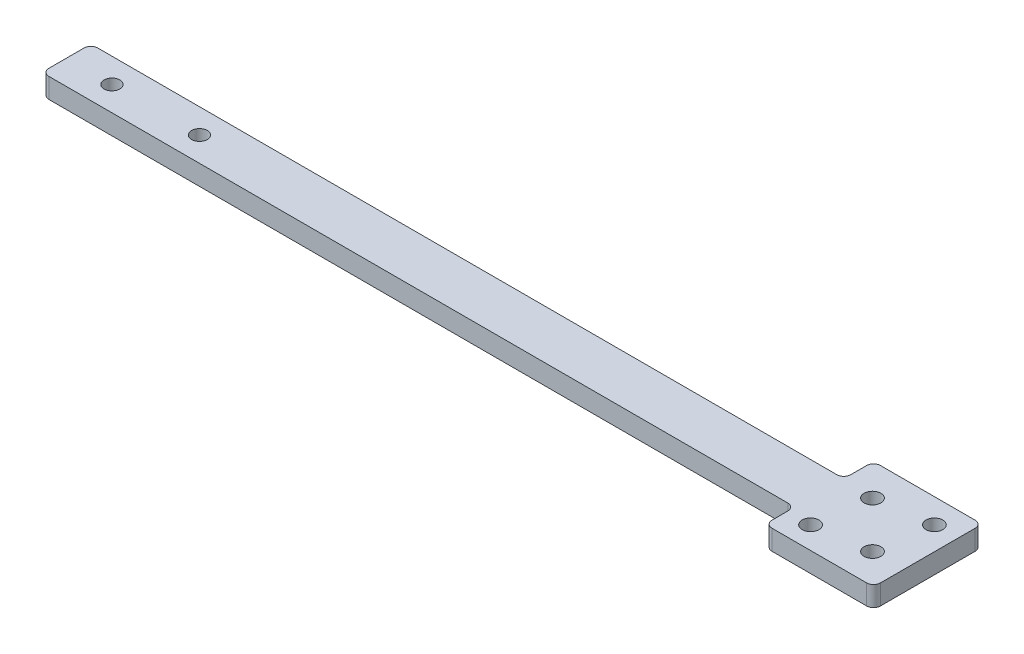
ISO-10303-21;
HEADER;
FILE_DESCRIPTION(('STEP AP214'),'2;1');
FILE_NAME('part.step','',(''),(''),'','','');
FILE_SCHEMA(('AUTOMOTIVE_DESIGN { 1 0 10303 214 1 1 1 1 }'));
ENDSEC;
DATA;
#1=APPLICATION_CONTEXT('core data for automotive mechanical design processes');
#2=APPLICATION_PROTOCOL_DEFINITION('international standard','automotive_design',2000,#1);
#3=PRODUCT_CONTEXT('',#1,'mechanical');
#4=PRODUCT('Part','Part','',(#3));
#5=PRODUCT_RELATED_PRODUCT_CATEGORY('part','',(#4));
#6=PRODUCT_DEFINITION_FORMATION('','',#4);
#7=PRODUCT_DEFINITION_CONTEXT('part definition',#1,'design');
#8=PRODUCT_DEFINITION('design','',#6,#7);
#9=PRODUCT_DEFINITION_SHAPE('','',#8);
#10=(LENGTH_UNIT() NAMED_UNIT(*) SI_UNIT(.MILLI.,.METRE.));
#11=(NAMED_UNIT(*) PLANE_ANGLE_UNIT() SI_UNIT($,.RADIAN.));
#12=(NAMED_UNIT(*) SI_UNIT($,.STERADIAN.) SOLID_ANGLE_UNIT());
#13=UNCERTAINTY_MEASURE_WITH_UNIT(LENGTH_MEASURE(1.E-05),#10,'distance_accuracy_value','');
#14=(GEOMETRIC_REPRESENTATION_CONTEXT(3) GLOBAL_UNCERTAINTY_ASSIGNED_CONTEXT((#13)) GLOBAL_UNIT_ASSIGNED_CONTEXT((#10,
#11,#12)) REPRESENTATION_CONTEXT('',''));
#15=CARTESIAN_POINT('',(0.,0.,0.));
#16=DIRECTION('',(0.,0.,1.));
#17=DIRECTION('',(1.,0.,0.));
#18=AXIS2_PLACEMENT_3D('',#15,#16,#17);
#19=CARTESIAN_POINT('',(-164.449923289991,5.715,-7.31043064824472));
#20=DIRECTION('',(1.,0.,0.));
#21=DIRECTION('',(0.,0.,-1.));
#22=AXIS2_PLACEMENT_3D('',#19,#20,#21);
#23=PLANE('',#22);
#24=DIRECTION('',(0.,0.,1.));
#25=VECTOR('',#24,1.);
#26=CARTESIAN_POINT('',(-164.449923289991,5.715,-7.31043064824472));
#27=LINE('',#26,#25);
#28=CARTESIAN_POINT('',(-164.449923289991,5.715,-5.31043064824472));
#29=VERTEX_POINT('',#28);
#30=CARTESIAN_POINT('',(-164.449923289991,5.715,4.68956935175528));
#31=VERTEX_POINT('',#30);
#32=EDGE_CURVE('E165',#29,#31,#27,.T.);
#33=ORIENTED_EDGE('',*,*,#32,.F.);
#34=DIRECTION('',(0.,-1.,0.));
#35=VECTOR('',#34,1.);
#36=CARTESIAN_POINT('',(-164.449923289991,5.715,-5.31043064824472));
#37=LINE('',#36,#35);
#38=CARTESIAN_POINT('',(-164.449923289991,0.,-5.31043064824472));
#39=VERTEX_POINT('',#38);
#40=EDGE_CURVE('E150',#29,#39,#37,.T.);
#41=ORIENTED_EDGE('',*,*,#40,.T.);
#42=DIRECTION('',(0.,0.,1.));
#43=VECTOR('',#42,1.);
#44=CARTESIAN_POINT('',(-164.449923289991,0.,-7.31043064824472));
#45=LINE('',#44,#43);
#46=CARTESIAN_POINT('',(-164.449923289991,0.,4.68956935175528));
#47=VERTEX_POINT('',#46);
#48=EDGE_CURVE('E162',#39,#47,#45,.T.);
#49=ORIENTED_EDGE('',*,*,#48,.T.);
#50=DIRECTION('',(0.,-1.,0.));
#51=VECTOR('',#50,1.);
#52=CARTESIAN_POINT('',(-164.449923289991,5.715,4.68956935175528));
#53=LINE('',#52,#51);
#54=EDGE_CURVE('E167',#47,#31,#53,.F.);
#55=ORIENTED_EDGE('',*,*,#54,.T.);
#56=EDGE_LOOP('',(#33,#41,#49,#55));
#57=FACE_BOUND('',#56,.T.);
#58=ADVANCED_FACE('F33',(#57),#23,.F.);
#59=CARTESIAN_POINT('',(-164.449923289991,5.715,6.68956935175528));
#60=DIRECTION('',(0.,0.,-1.));
#61=DIRECTION('',(-1.,0.,0.));
#62=AXIS2_PLACEMENT_3D('',#59,#60,#61);
#63=PLANE('',#62);
#64=DIRECTION('',(1.,0.,0.));
#65=VECTOR('',#64,1.);
#66=CARTESIAN_POINT('',(-164.449923289991,5.715,6.68956935175528));
#67=LINE('',#66,#65);
#68=CARTESIAN_POINT('',(-162.449923289991,5.715,6.68956935175528));
#69=VERTEX_POINT('',#68);
#70=CARTESIAN_POINT('',(48.5500767100088,5.715,6.68956935175528));
#71=VERTEX_POINT('',#70);
#72=EDGE_CURVE('E203',#69,#71,#67,.T.);
#73=ORIENTED_EDGE('',*,*,#72,.F.);
#74=DIRECTION('',(0.,-1.,0.));
#75=VECTOR('',#74,1.);
#76=CARTESIAN_POINT('',(-162.449923289991,5.715,6.68956935175528));
#77=LINE('',#76,#75);
#78=CARTESIAN_POINT('',(-162.449923289991,0.,6.68956935175528));
#79=VERTEX_POINT('',#78);
#80=EDGE_CURVE('E259',#69,#79,#77,.T.);
#81=ORIENTED_EDGE('',*,*,#80,.T.);
#82=DIRECTION('',(1.,0.,0.));
#83=VECTOR('',#82,1.);
#84=CARTESIAN_POINT('',(-164.449923289991,0.,6.68956935175528));
#85=LINE('',#84,#83);
#86=CARTESIAN_POINT('',(48.5500767100088,0.,6.68956935175528));
#87=VERTEX_POINT('',#86);
#88=EDGE_CURVE('E171',#79,#87,#85,.T.);
#89=ORIENTED_EDGE('',*,*,#88,.T.);
#90=DIRECTION('',(0.,-1.,0.));
#91=VECTOR('',#90,1.);
#92=CARTESIAN_POINT('',(48.5500767100088,5.715,6.68956935175528));
#93=LINE('',#92,#91);
#94=EDGE_CURVE('E256',#87,#71,#93,.F.);
#95=ORIENTED_EDGE('',*,*,#94,.T.);
#96=EDGE_LOOP('',(#73,#81,#89,#95));
#97=FACE_BOUND('',#96,.T.);
#98=ADVANCED_FACE('F299',(#97),#63,.F.);
#99=CARTESIAN_POINT('',(-164.449923289991,5.715,-7.31043064824472));
#100=DIRECTION('',(0.,0.,1.));
#101=DIRECTION('',(1.,0.,0.));
#102=AXIS2_PLACEMENT_3D('',#99,#100,#101);
#103=PLANE('',#102);
#104=DIRECTION('',(-1.,0.,0.));
#105=VECTOR('',#104,1.);
#106=CARTESIAN_POINT('',(-164.449923289991,0.,-7.31043064824472));
#107=LINE('',#106,#105);
#108=CARTESIAN_POINT('',(48.5500767100088,0.,-7.31043064824472));
#109=VERTEX_POINT('',#108);
#110=CARTESIAN_POINT('',(-162.449923289991,0.,-7.31043064824472));
#111=VERTEX_POINT('',#110);
#112=EDGE_CURVE('E175',#109,#111,#107,.T.);
#113=ORIENTED_EDGE('',*,*,#112,.T.);
#114=DIRECTION('',(0.,-1.,0.));
#115=VECTOR('',#114,1.);
#116=CARTESIAN_POINT('',(-162.449923289991,5.715,-7.31043064824472));
#117=LINE('',#116,#115);
#118=CARTESIAN_POINT('',(-162.449923289991,5.715,-7.31043064824472));
#119=VERTEX_POINT('',#118);
#120=EDGE_CURVE('E151',#111,#119,#117,.F.);
#121=ORIENTED_EDGE('',*,*,#120,.T.);
#122=DIRECTION('',(-1.,0.,0.));
#123=VECTOR('',#122,1.);
#124=CARTESIAN_POINT('',(-164.449923289991,5.715,-7.31043064824472));
#125=LINE('',#124,#123);
#126=CARTESIAN_POINT('',(48.5500767100088,5.715,-7.31043064824472));
#127=VERTEX_POINT('',#126);
#128=EDGE_CURVE('E200',#127,#119,#125,.T.);
#129=ORIENTED_EDGE('',*,*,#128,.F.);
#130=DIRECTION('',(0.,-1.,0.));
#131=VECTOR('',#130,1.);
#132=CARTESIAN_POINT('',(48.5500767100088,5.715,-7.31043064824472));
#133=LINE('',#132,#131);
#134=EDGE_CURVE('E156',#127,#109,#133,.T.);
#135=ORIENTED_EDGE('',*,*,#134,.T.);
#136=EDGE_LOOP('',(#113,#121,#129,#135));
#137=FACE_BOUND('',#136,.T.);
#138=ADVANCED_FACE('F246',(#137),#103,.F.);
#139=CARTESIAN_POINT('',(0.,5.715,0.));
#140=DIRECTION('',(0.,1.,0.));
#141=DIRECTION('',(0.,0.,1.));
#142=AXIS2_PLACEMENT_3D('',#139,#140,#141);
#143=PLANE('',#142);
#144=CARTESIAN_POINT('',(72.6615251141029,5.715,6.61144840409427));
#145=DIRECTION('',(0.,1.,0.));
#146=DIRECTION('',(0.,0.,1.));
#147=AXIS2_PLACEMENT_3D('',#144,#145,#146);
#148=CIRCLE('',#147,2.40000000000001);
#149=CARTESIAN_POINT('',(72.6615251141029,5.715,9.01144840409428));
#150=VERTEX_POINT('',#149);
#151=EDGE_CURVE('E353',#150,#150,#148,.T.);
#152=ORIENTED_EDGE('',*,*,#151,.F.);
#153=EDGE_LOOP('',(#152));
#154=FACE_BOUND('',#153,.T.);
#155=CARTESIAN_POINT('',(74.8889114748407,5.715,-8.83883476483178));
#156=DIRECTION('',(0.,1.,0.));
#157=DIRECTION('',(0.,0.,1.));
#158=AXIS2_PLACEMENT_3D('',#155,#156,#157);
#159=CIRCLE('',#158,2.39999999999999);
#160=CARTESIAN_POINT('',(74.8889114748407,5.715,-6.43883476483179));
#161=VERTEX_POINT('',#160);
#162=EDGE_CURVE('E349',#161,#161,#159,.T.);
#163=ORIENTED_EDGE('',*,*,#162,.F.);
#164=EDGE_LOOP('',(#163));
#165=FACE_BOUND('',#164,.T.);
#166=CARTESIAN_POINT('',(59.4386283059146,5.715,-6.61144840409425));
#167=DIRECTION('',(0.,1.,0.));
#168=DIRECTION('',(0.,0.,1.));
#169=AXIS2_PLACEMENT_3D('',#166,#167,#168);
#170=CIRCLE('',#169,2.39999999999999);
#171=CARTESIAN_POINT('',(59.4386283059146,5.715,-4.21144840409426));
#172=VERTEX_POINT('',#171);
#173=EDGE_CURVE('E345',#172,#172,#170,.T.);
#174=ORIENTED_EDGE('',*,*,#173,.F.);
#175=EDGE_LOOP('',(#174));
#176=FACE_BOUND('',#175,.T.);
#177=CARTESIAN_POINT('',(57.2112419451769,5.715,8.83883476483181));
#178=DIRECTION('',(0.,1.,0.));
#179=DIRECTION('',(0.,0.,1.));
#180=AXIS2_PLACEMENT_3D('',#177,#178,#179);
#181=CIRCLE('',#180,2.40000000000002);
#182=CARTESIAN_POINT('',(57.2112419451769,5.715,11.2388347648318));
#183=VERTEX_POINT('',#182);
#184=EDGE_CURVE('E314',#183,#183,#181,.T.);
#185=ORIENTED_EDGE('',*,*,#184,.F.);
#186=EDGE_LOOP('',(#185));
#187=FACE_BOUND('',#186,.T.);
#188=CARTESIAN_POINT('',(-126.449923289991,5.715,-0.31043064824469));
#189=DIRECTION('',(0.,1.,0.));
#190=DIRECTION('',(0.,0.,1.));
#191=AXIS2_PLACEMENT_3D('',#188,#189,#190);
#192=CIRCLE('',#191,2.25);
#193=CARTESIAN_POINT('',(-126.449923289991,5.715,1.93956935175531));
#194=VERTEX_POINT('',#193);
#195=EDGE_CURVE('E234',#194,#194,#192,.T.);
#196=ORIENTED_EDGE('',*,*,#195,.F.);
#197=EDGE_LOOP('',(#196));
#198=FACE_BOUND('',#197,.T.);
#199=CARTESIAN_POINT('',(-151.449923289991,5.715,-0.31043064824469));
#200=DIRECTION('',(0.,1.,0.));
#201=DIRECTION('',(0.,0.,1.));
#202=AXIS2_PLACEMENT_3D('',#199,#200,#201);
#203=CIRCLE('',#202,2.25000000000001);
#204=CARTESIAN_POINT('',(-151.449923289991,5.715,1.93956935175532));
#205=VERTEX_POINT('',#204);
#206=EDGE_CURVE('E178',#205,#205,#203,.T.);
#207=ORIENTED_EDGE('',*,*,#206,.F.);
#208=EDGE_LOOP('',(#207));
#209=FACE_BOUND('',#208,.T.);
#210=ORIENTED_EDGE('',*,*,#128,.T.);
#211=CARTESIAN_POINT('',(-162.449923289991,5.715,-5.31043064824472));
#212=DIRECTION('',(0.,1.,0.));
#213=DIRECTION('',(0.,0.,1.));
#214=AXIS2_PLACEMENT_3D('',#211,#212,#213);
#215=CIRCLE('',#214,2.);
#216=EDGE_CURVE('E250',#119,#29,#215,.T.);
#217=ORIENTED_EDGE('',*,*,#216,.T.);
#218=ORIENTED_EDGE('',*,*,#32,.T.);
#219=CARTESIAN_POINT('',(-162.449923289991,5.715,4.68956935175528));
#220=DIRECTION('',(0.,1.,0.));
#221=DIRECTION('',(0.,0.,1.));
#222=AXIS2_PLACEMENT_3D('',#219,#220,#221);
#223=CIRCLE('',#222,2.);
#224=EDGE_CURVE('E257',#31,#69,#223,.T.);
#225=ORIENTED_EDGE('',*,*,#224,.T.);
#226=ORIENTED_EDGE('',*,*,#72,.T.);
#227=CARTESIAN_POINT('',(48.5500767100088,5.715,8.68956935175528));
#228=DIRECTION('',(0.,1.,0.));
#229=DIRECTION('',(0.,0.,1.));
#230=AXIS2_PLACEMENT_3D('',#227,#228,#229);
#231=CIRCLE('',#230,2.);
#232=CARTESIAN_POINT('',(50.5500767100088,5.715,8.68956935175528));
#233=VERTEX_POINT('',#232);
#234=EDGE_CURVE('E11',#71,#233,#231,.F.);
#235=ORIENTED_EDGE('',*,*,#234,.T.);
#236=DIRECTION('',(0.,0.,1.));
#237=VECTOR('',#236,1.);
#238=CARTESIAN_POINT('',(50.5500767100088,5.715,-15.8104306482447));
#239=LINE('',#238,#237);
#240=CARTESIAN_POINT('',(50.5500767100088,5.715,13.1895693517553));
#241=VERTEX_POINT('',#240);
#242=EDGE_CURVE('E306',#233,#241,#239,.T.);
#243=ORIENTED_EDGE('',*,*,#242,.T.);
#244=CARTESIAN_POINT('',(52.5500767100088,5.715,13.1895693517553));
#245=DIRECTION('',(0.,1.,0.));
#246=DIRECTION('',(0.,0.,1.));
#247=AXIS2_PLACEMENT_3D('',#244,#245,#246);
#248=CIRCLE('',#247,2.);
#249=CARTESIAN_POINT('',(52.5500767100088,5.715,15.1895693517553));
#250=VERTEX_POINT('',#249);
#251=EDGE_CURVE('E317',#241,#250,#248,.T.);
#252=ORIENTED_EDGE('',*,*,#251,.T.);
#253=DIRECTION('',(-1.,0.,0.));
#254=VECTOR('',#253,1.);
#255=CARTESIAN_POINT('',(81.5500767100088,5.715,15.1895693517553));
#256=LINE('',#255,#254);
#257=CARTESIAN_POINT('',(79.5500767100088,5.715,15.1895693517553));
#258=VERTEX_POINT('',#257);
#259=EDGE_CURVE('E229',#258,#250,#256,.T.);
#260=ORIENTED_EDGE('',*,*,#259,.F.);
#261=CARTESIAN_POINT('',(79.5500767100088,5.715,13.1895693517553));
#262=DIRECTION('',(0.,1.,0.));
#263=DIRECTION('',(0.,0.,1.));
#264=AXIS2_PLACEMENT_3D('',#261,#262,#263);
#265=CIRCLE('',#264,2.);
#266=CARTESIAN_POINT('',(81.5500767100088,5.715,13.1895693517553));
#267=VERTEX_POINT('',#266);
#268=EDGE_CURVE('E319',#258,#267,#265,.T.);
#269=ORIENTED_EDGE('',*,*,#268,.T.);
#270=DIRECTION('',(0.,0.,1.));
#271=VECTOR('',#270,1.);
#272=CARTESIAN_POINT('',(81.5500767100088,5.715,-15.8104306482447));
#273=LINE('',#272,#271);
#274=CARTESIAN_POINT('',(81.5500767100088,5.715,-13.8104306482447));
#275=VERTEX_POINT('',#274);
#276=EDGE_CURVE('E325',#275,#267,#273,.T.);
#277=ORIENTED_EDGE('',*,*,#276,.F.);
#278=CARTESIAN_POINT('',(79.5500767100088,5.715,-13.8104306482447));
#279=DIRECTION('',(0.,1.,0.));
#280=DIRECTION('',(0.,0.,1.));
#281=AXIS2_PLACEMENT_3D('',#278,#279,#280);
#282=CIRCLE('',#281,2.);
#283=CARTESIAN_POINT('',(79.5500767100088,5.715,-15.8104306482447));
#284=VERTEX_POINT('',#283);
#285=EDGE_CURVE('E321',#275,#284,#282,.T.);
#286=ORIENTED_EDGE('',*,*,#285,.T.);
#287=DIRECTION('',(-1.,0.,0.));
#288=VECTOR('',#287,1.);
#289=CARTESIAN_POINT('',(81.5500767100088,5.715,-15.8104306482447));
#290=LINE('',#289,#288);
#291=CARTESIAN_POINT('',(52.5500767100088,5.715,-15.8104306482447));
#292=VERTEX_POINT('',#291);
#293=EDGE_CURVE('E232',#284,#292,#290,.T.);
#294=ORIENTED_EDGE('',*,*,#293,.T.);
#295=CARTESIAN_POINT('',(52.5500767100088,5.715,-13.8104306482447));
#296=DIRECTION('',(0.,1.,0.));
#297=DIRECTION('',(0.,0.,1.));
#298=AXIS2_PLACEMENT_3D('',#295,#296,#297);
#299=CIRCLE('',#298,2.);
#300=CARTESIAN_POINT('',(50.5500767100088,5.715,-13.8104306482447));
#301=VERTEX_POINT('',#300);
#302=EDGE_CURVE('E55',#292,#301,#299,.T.);
#303=ORIENTED_EDGE('',*,*,#302,.T.);
#304=CARTESIAN_POINT('',(50.5500767100088,5.715,-9.31043064824472));
#305=VERTEX_POINT('',#304);
#306=EDGE_CURVE('E215',#301,#305,#239,.T.);
#307=ORIENTED_EDGE('',*,*,#306,.T.);
#308=CARTESIAN_POINT('',(48.5500767100088,5.715,-9.31043064824472));
#309=DIRECTION('',(0.,1.,0.));
#310=DIRECTION('',(0.,0.,1.));
#311=AXIS2_PLACEMENT_3D('',#308,#309,#310);
#312=CIRCLE('',#311,2.);
#313=EDGE_CURVE('E252',#305,#127,#312,.F.);
#314=ORIENTED_EDGE('',*,*,#313,.T.);
#315=EDGE_LOOP('',(#210,#217,#218,#225,#226,#235,#243,#252,#260,#269,#277,#286,#294,#303,#307,#314));
#316=FACE_BOUND('',#315,.T.);
#317=ADVANCED_FACE('F244',(#154,#165,#176,#187,#198,#209,#316),#143,.T.);
#318=CARTESIAN_POINT('',(0.,0.,0.));
#319=DIRECTION('',(0.,1.,0.));
#320=DIRECTION('',(0.,0.,1.));
#321=AXIS2_PLACEMENT_3D('',#318,#319,#320);
#322=PLANE('',#321);
#323=CARTESIAN_POINT('',(72.6615251141029,0.,6.61144840409427));
#324=DIRECTION('',(0.,1.,0.));
#325=DIRECTION('',(0.,0.,1.));
#326=AXIS2_PLACEMENT_3D('',#323,#324,#325);
#327=CIRCLE('',#326,2.40000000000001);
#328=CARTESIAN_POINT('',(72.6615251141029,0.,9.01144840409428));
#329=VERTEX_POINT('',#328);
#330=EDGE_CURVE('E352',#329,#329,#327,.T.);
#331=ORIENTED_EDGE('',*,*,#330,.T.);
#332=EDGE_LOOP('',(#331));
#333=FACE_BOUND('',#332,.T.);
#334=CARTESIAN_POINT('',(74.8889114748407,0.,-8.83883476483178));
#335=DIRECTION('',(0.,1.,0.));
#336=DIRECTION('',(0.,0.,1.));
#337=AXIS2_PLACEMENT_3D('',#334,#335,#336);
#338=CIRCLE('',#337,2.39999999999999);
#339=CARTESIAN_POINT('',(74.8889114748407,0.,-6.43883476483179));
#340=VERTEX_POINT('',#339);
#341=EDGE_CURVE('E348',#340,#340,#338,.T.);
#342=ORIENTED_EDGE('',*,*,#341,.T.);
#343=EDGE_LOOP('',(#342));
#344=FACE_BOUND('',#343,.T.);
#345=CARTESIAN_POINT('',(59.4386283059146,0.,-6.61144840409425));
#346=DIRECTION('',(0.,1.,0.));
#347=DIRECTION('',(0.,0.,1.));
#348=AXIS2_PLACEMENT_3D('',#345,#346,#347);
#349=CIRCLE('',#348,2.39999999999999);
#350=CARTESIAN_POINT('',(59.4386283059146,0.,-4.21144840409426));
#351=VERTEX_POINT('',#350);
#352=EDGE_CURVE('E344',#351,#351,#349,.T.);
#353=ORIENTED_EDGE('',*,*,#352,.T.);
#354=EDGE_LOOP('',(#353));
#355=FACE_BOUND('',#354,.T.);
#356=CARTESIAN_POINT('',(57.2112419451769,0.,8.83883476483181));
#357=DIRECTION('',(0.,1.,0.));
#358=DIRECTION('',(0.,0.,1.));
#359=AXIS2_PLACEMENT_3D('',#356,#357,#358);
#360=CIRCLE('',#359,2.40000000000002);
#361=CARTESIAN_POINT('',(57.2112419451769,0.,11.2388347648318));
#362=VERTEX_POINT('',#361);
#363=EDGE_CURVE('E209',#362,#362,#360,.T.);
#364=ORIENTED_EDGE('',*,*,#363,.T.);
#365=EDGE_LOOP('',(#364));
#366=FACE_BOUND('',#365,.T.);
#367=CARTESIAN_POINT('',(-126.449923289991,0.,-0.31043064824469));
#368=DIRECTION('',(0.,1.,0.));
#369=DIRECTION('',(0.,0.,1.));
#370=AXIS2_PLACEMENT_3D('',#367,#368,#369);
#371=CIRCLE('',#370,2.25);
#372=CARTESIAN_POINT('',(-126.449923289991,0.,1.93956935175531));
#373=VERTEX_POINT('',#372);
#374=EDGE_CURVE('E235',#373,#373,#371,.T.);
#375=ORIENTED_EDGE('',*,*,#374,.T.);
#376=EDGE_LOOP('',(#375));
#377=FACE_BOUND('',#376,.T.);
#378=CARTESIAN_POINT('',(-151.449923289991,0.,-0.31043064824469));
#379=DIRECTION('',(0.,1.,0.));
#380=DIRECTION('',(0.,0.,1.));
#381=AXIS2_PLACEMENT_3D('',#378,#379,#380);
#382=CIRCLE('',#381,2.25000000000001);
#383=CARTESIAN_POINT('',(-151.449923289991,0.,1.93956935175532));
#384=VERTEX_POINT('',#383);
#385=EDGE_CURVE('E172',#384,#384,#382,.T.);
#386=ORIENTED_EDGE('',*,*,#385,.T.);
#387=EDGE_LOOP('',(#386));
#388=FACE_BOUND('',#387,.T.);
#389=ORIENTED_EDGE('',*,*,#48,.F.);
#390=CARTESIAN_POINT('',(-162.449923289991,0.,-5.31043064824472));
#391=DIRECTION('',(0.,1.,0.));
#392=DIRECTION('',(0.,0.,1.));
#393=AXIS2_PLACEMENT_3D('',#390,#391,#392);
#394=CIRCLE('',#393,2.);
#395=EDGE_CURVE('E146',#39,#111,#394,.F.);
#396=ORIENTED_EDGE('',*,*,#395,.T.);
#397=ORIENTED_EDGE('',*,*,#112,.F.);
#398=CARTESIAN_POINT('',(48.5500767100088,0.,-9.31043064824472));
#399=DIRECTION('',(0.,1.,0.));
#400=DIRECTION('',(0.,0.,1.));
#401=AXIS2_PLACEMENT_3D('',#398,#399,#400);
#402=CIRCLE('',#401,2.);
#403=CARTESIAN_POINT('',(50.5500767100088,0.,-9.31043064824472));
#404=VERTEX_POINT('',#403);
#405=EDGE_CURVE('E290',#109,#404,#402,.T.);
#406=ORIENTED_EDGE('',*,*,#405,.T.);
#407=DIRECTION('',(0.,0.,-1.));
#408=VECTOR('',#407,1.);
#409=CARTESIAN_POINT('',(50.5500767100088,0.,-15.8104306482447));
#410=LINE('',#409,#408);
#411=CARTESIAN_POINT('',(50.5500767100088,0.,-13.8104306482447));
#412=VERTEX_POINT('',#411);
#413=EDGE_CURVE('E213',#404,#412,#410,.T.);
#414=ORIENTED_EDGE('',*,*,#413,.T.);
#415=CARTESIAN_POINT('',(52.5500767100088,0.,-13.8104306482447));
#416=DIRECTION('',(0.,1.,0.));
#417=DIRECTION('',(0.,0.,1.));
#418=AXIS2_PLACEMENT_3D('',#415,#416,#417);
#419=CIRCLE('',#418,2.);
#420=CARTESIAN_POINT('',(52.5500767100088,0.,-15.8104306482447));
#421=VERTEX_POINT('',#420);
#422=EDGE_CURVE('E197',#412,#421,#419,.F.);
#423=ORIENTED_EDGE('',*,*,#422,.T.);
#424=DIRECTION('',(-1.,0.,0.));
#425=VECTOR('',#424,1.);
#426=CARTESIAN_POINT('',(81.5500767100088,0.,-15.8104306482447));
#427=LINE('',#426,#425);
#428=CARTESIAN_POINT('',(79.5500767100088,0.,-15.8104306482447));
#429=VERTEX_POINT('',#428);
#430=EDGE_CURVE('E221',#429,#421,#427,.T.);
#431=ORIENTED_EDGE('',*,*,#430,.F.);
#432=CARTESIAN_POINT('',(79.5500767100088,0.,-13.8104306482447));
#433=DIRECTION('',(0.,1.,0.));
#434=DIRECTION('',(0.,0.,1.));
#435=AXIS2_PLACEMENT_3D('',#432,#433,#434);
#436=CIRCLE('',#435,2.);
#437=CARTESIAN_POINT('',(81.5500767100088,0.,-13.8104306482447));
#438=VERTEX_POINT('',#437);
#439=EDGE_CURVE('E195',#429,#438,#436,.F.);
#440=ORIENTED_EDGE('',*,*,#439,.T.);
#441=DIRECTION('',(0.,0.,-1.));
#442=VECTOR('',#441,1.);
#443=CARTESIAN_POINT('',(81.5500767100088,0.,-15.8104306482447));
#444=LINE('',#443,#442);
#445=CARTESIAN_POINT('',(81.5500767100088,0.,13.1895693517553));
#446=VERTEX_POINT('',#445);
#447=EDGE_CURVE('E226',#446,#438,#444,.T.);
#448=ORIENTED_EDGE('',*,*,#447,.F.);
#449=CARTESIAN_POINT('',(79.5500767100088,0.,13.1895693517553));
#450=DIRECTION('',(0.,1.,0.));
#451=DIRECTION('',(0.,0.,1.));
#452=AXIS2_PLACEMENT_3D('',#449,#450,#451);
#453=CIRCLE('',#452,2.);
#454=CARTESIAN_POINT('',(79.5500767100088,0.,15.1895693517553));
#455=VERTEX_POINT('',#454);
#456=EDGE_CURVE('E193',#446,#455,#453,.F.);
#457=ORIENTED_EDGE('',*,*,#456,.T.);
#458=DIRECTION('',(-1.,0.,0.));
#459=VECTOR('',#458,1.);
#460=CARTESIAN_POINT('',(81.5500767100088,0.,15.1895693517553));
#461=LINE('',#460,#459);
#462=CARTESIAN_POINT('',(52.5500767100088,0.,15.1895693517553));
#463=VERTEX_POINT('',#462);
#464=EDGE_CURVE('E225',#455,#463,#461,.T.);
#465=ORIENTED_EDGE('',*,*,#464,.T.);
#466=CARTESIAN_POINT('',(52.5500767100088,0.,13.1895693517553));
#467=DIRECTION('',(0.,1.,0.));
#468=DIRECTION('',(0.,0.,1.));
#469=AXIS2_PLACEMENT_3D('',#466,#467,#468);
#470=CIRCLE('',#469,2.);
#471=CARTESIAN_POINT('',(50.5500767100088,0.,13.1895693517553));
#472=VERTEX_POINT('',#471);
#473=EDGE_CURVE('E166',#463,#472,#470,.F.);
#474=ORIENTED_EDGE('',*,*,#473,.T.);
#475=CARTESIAN_POINT('',(50.5500767100088,0.,8.68956935175528));
#476=VERTEX_POINT('',#475);
#477=EDGE_CURVE('E189',#472,#476,#410,.T.);
#478=ORIENTED_EDGE('',*,*,#477,.T.);
#479=CARTESIAN_POINT('',(48.5500767100088,0.,8.68956935175528));
#480=DIRECTION('',(0.,1.,0.));
#481=DIRECTION('',(0.,0.,1.));
#482=AXIS2_PLACEMENT_3D('',#479,#480,#481);
#483=CIRCLE('',#482,2.);
#484=EDGE_CURVE('E41',#476,#87,#483,.T.);
#485=ORIENTED_EDGE('',*,*,#484,.T.);
#486=ORIENTED_EDGE('',*,*,#88,.F.);
#487=CARTESIAN_POINT('',(-162.449923289991,0.,4.68956935175528));
#488=DIRECTION('',(0.,1.,0.));
#489=DIRECTION('',(0.,0.,1.));
#490=AXIS2_PLACEMENT_3D('',#487,#488,#489);
#491=CIRCLE('',#490,2.);
#492=EDGE_CURVE('E157',#79,#47,#491,.F.);
#493=ORIENTED_EDGE('',*,*,#492,.T.);
#494=EDGE_LOOP('',(#389,#396,#397,#406,#414,#423,#431,#440,#448,#457,#465,#474,#478,#485,#486,#493));
#495=FACE_BOUND('',#494,.T.);
#496=ADVANCED_FACE('F169',(#333,#344,#355,#366,#377,#388,#495),#322,.F.);
#497=CARTESIAN_POINT('',(-151.449923289991,0.,-0.31043064824469));
#498=DIRECTION('',(0.,1.,0.));
#499=DIRECTION('',(0.,0.,1.));
#500=AXIS2_PLACEMENT_3D('',#497,#498,#499);
#501=CYLINDRICAL_SURFACE('',#500,2.25000000000001);
#502=ORIENTED_EDGE('',*,*,#385,.F.);
#503=EDGE_LOOP('',(#502));
#504=FACE_BOUND('',#503,.T.);
#505=ORIENTED_EDGE('',*,*,#206,.T.);
#506=EDGE_LOOP('',(#505));
#507=FACE_BOUND('',#506,.T.);
#508=ADVANCED_FACE('F242',(#504,#507),#501,.F.);
#509=CARTESIAN_POINT('',(-126.449923289991,0.,-0.31043064824469));
#510=DIRECTION('',(0.,1.,0.));
#511=DIRECTION('',(0.,0.,1.));
#512=AXIS2_PLACEMENT_3D('',#509,#510,#511);
#513=CYLINDRICAL_SURFACE('',#512,2.25);
#514=ORIENTED_EDGE('',*,*,#374,.F.);
#515=EDGE_LOOP('',(#514));
#516=FACE_BOUND('',#515,.T.);
#517=ORIENTED_EDGE('',*,*,#195,.T.);
#518=EDGE_LOOP('',(#517));
#519=FACE_BOUND('',#518,.T.);
#520=ADVANCED_FACE('F389',(#516,#519),#513,.F.);
#521=CARTESIAN_POINT('',(50.5500767100088,0.,0.));
#522=DIRECTION('',(-1.,0.,0.));
#523=DIRECTION('',(0.,0.,1.));
#524=AXIS2_PLACEMENT_3D('',#521,#522,#523);
#525=PLANE('',#524);
#526=ORIENTED_EDGE('',*,*,#413,.F.);
#527=DIRECTION('',(0.,-1.,0.));
#528=VECTOR('',#527,1.);
#529=CARTESIAN_POINT('',(50.5500767100088,0.,-9.31043064824472));
#530=LINE('',#529,#528);
#531=EDGE_CURVE('E48',#404,#305,#530,.F.);
#532=ORIENTED_EDGE('',*,*,#531,.T.);
#533=ORIENTED_EDGE('',*,*,#306,.F.);
#534=DIRECTION('',(0.,1.,0.));
#535=VECTOR('',#534,1.);
#536=CARTESIAN_POINT('',(50.5500767100088,0.,-13.8104306482447));
#537=LINE('',#536,#535);
#538=EDGE_CURVE('E266',#301,#412,#537,.F.);
#539=ORIENTED_EDGE('',*,*,#538,.T.);
#540=EDGE_LOOP('',(#526,#532,#533,#539));
#541=FACE_BOUND('',#540,.T.);
#542=ADVANCED_FACE('F393',(#541),#525,.T.);
#543=CARTESIAN_POINT('',(81.5500767100088,5.715,-15.8104306482447));
#544=DIRECTION('',(0.,0.,1.));
#545=DIRECTION('',(0.,-1.,0.));
#546=AXIS2_PLACEMENT_3D('',#543,#544,#545);
#547=PLANE('',#546);
#548=ORIENTED_EDGE('',*,*,#430,.T.);
#549=DIRECTION('',(0.,1.,0.));
#550=VECTOR('',#549,1.);
#551=CARTESIAN_POINT('',(52.5500767100088,5.715,-15.8104306482447));
#552=LINE('',#551,#550);
#553=EDGE_CURVE('E276',#421,#292,#552,.T.);
#554=ORIENTED_EDGE('',*,*,#553,.T.);
#555=ORIENTED_EDGE('',*,*,#293,.F.);
#556=DIRECTION('',(0.,1.,0.));
#557=VECTOR('',#556,1.);
#558=CARTESIAN_POINT('',(79.5500767100088,5.715,-15.8104306482447));
#559=LINE('',#558,#557);
#560=EDGE_CURVE('E274',#284,#429,#559,.F.);
#561=ORIENTED_EDGE('',*,*,#560,.T.);
#562=EDGE_LOOP('',(#548,#554,#555,#561));
#563=FACE_BOUND('',#562,.T.);
#564=ADVANCED_FACE('F330',(#563),#547,.F.);
#565=CARTESIAN_POINT('',(81.5500767100088,5.715,15.1895693517553));
#566=DIRECTION('',(0.,0.,-1.));
#567=DIRECTION('',(-1.,0.,0.));
#568=AXIS2_PLACEMENT_3D('',#565,#566,#567);
#569=PLANE('',#568);
#570=ORIENTED_EDGE('',*,*,#464,.F.);
#571=DIRECTION('',(0.,-1.,0.));
#572=VECTOR('',#571,1.);
#573=CARTESIAN_POINT('',(79.5500767100088,5.715,15.1895693517553));
#574=LINE('',#573,#572);
#575=EDGE_CURVE('E288',#455,#258,#574,.F.);
#576=ORIENTED_EDGE('',*,*,#575,.T.);
#577=ORIENTED_EDGE('',*,*,#259,.T.);
#578=DIRECTION('',(0.,-1.,0.));
#579=VECTOR('',#578,1.);
#580=CARTESIAN_POINT('',(52.5500767100088,0.,15.1895693517553));
#581=LINE('',#580,#579);
#582=EDGE_CURVE('E285',#250,#463,#581,.T.);
#583=ORIENTED_EDGE('',*,*,#582,.T.);
#584=EDGE_LOOP('',(#570,#576,#577,#583));
#585=FACE_BOUND('',#584,.T.);
#586=ADVANCED_FACE('F397',(#585),#569,.F.);
#587=CARTESIAN_POINT('',(81.5500767100088,0.,0.));
#588=DIRECTION('',(-1.,0.,0.));
#589=DIRECTION('',(0.,0.,1.));
#590=AXIS2_PLACEMENT_3D('',#587,#588,#589);
#591=PLANE('',#590);
#592=ORIENTED_EDGE('',*,*,#447,.T.);
#593=DIRECTION('',(0.,1.,0.));
#594=VECTOR('',#593,1.);
#595=CARTESIAN_POINT('',(81.5500767100088,0.,-13.8104306482447));
#596=LINE('',#595,#594);
#597=EDGE_CURVE('E282',#438,#275,#596,.T.);
#598=ORIENTED_EDGE('',*,*,#597,.T.);
#599=ORIENTED_EDGE('',*,*,#276,.T.);
#600=DIRECTION('',(0.,-1.,0.));
#601=VECTOR('',#600,1.);
#602=CARTESIAN_POINT('',(81.5500767100088,0.,13.1895693517553));
#603=LINE('',#602,#601);
#604=EDGE_CURVE('E279',#267,#446,#603,.T.);
#605=ORIENTED_EDGE('',*,*,#604,.T.);
#606=EDGE_LOOP('',(#592,#598,#599,#605));
#607=FACE_BOUND('',#606,.T.);
#608=ADVANCED_FACE('F338',(#607),#591,.F.);
#609=ORIENTED_EDGE('',*,*,#242,.F.);
#610=DIRECTION('',(0.,-1.,0.));
#611=VECTOR('',#610,1.);
#612=CARTESIAN_POINT('',(50.5500767100088,0.,8.68956935175528));
#613=LINE('',#612,#611);
#614=EDGE_CURVE('E271',#233,#476,#613,.T.);
#615=ORIENTED_EDGE('',*,*,#614,.T.);
#616=ORIENTED_EDGE('',*,*,#477,.F.);
#617=DIRECTION('',(0.,-1.,0.));
#618=VECTOR('',#617,1.);
#619=CARTESIAN_POINT('',(50.5500767100088,5.715,13.1895693517553));
#620=LINE('',#619,#618);
#621=EDGE_CURVE('E269',#472,#241,#620,.F.);
#622=ORIENTED_EDGE('',*,*,#621,.T.);
#623=EDGE_LOOP('',(#609,#615,#616,#622));
#624=FACE_BOUND('',#623,.T.);
#625=ADVANCED_FACE('F309',(#624),#525,.T.);
#626=CARTESIAN_POINT('',(57.2112419451769,-5.00000000023051E-05,8.83883476483181));
#627=DIRECTION('',(0.,1.,0.));
#628=DIRECTION('',(0.,0.,1.));
#629=AXIS2_PLACEMENT_3D('',#626,#627,#628);
#630=CYLINDRICAL_SURFACE('',#629,2.40000000000002);
#631=ORIENTED_EDGE('',*,*,#184,.T.);
#632=EDGE_LOOP('',(#631));
#633=FACE_BOUND('',#632,.T.);
#634=ORIENTED_EDGE('',*,*,#363,.F.);
#635=EDGE_LOOP('',(#634));
#636=FACE_BOUND('',#635,.T.);
#637=ADVANCED_FACE('F403',(#633,#636),#630,.F.);
#638=CARTESIAN_POINT('',(59.4386283059146,-5.00000000023051E-05,-6.61144840409425));
#639=DIRECTION('',(0.,1.,0.));
#640=DIRECTION('',(0.,0.,1.));
#641=AXIS2_PLACEMENT_3D('',#638,#639,#640);
#642=CYLINDRICAL_SURFACE('',#641,2.39999999999999);
#643=ORIENTED_EDGE('',*,*,#173,.T.);
#644=EDGE_LOOP('',(#643));
#645=FACE_BOUND('',#644,.T.);
#646=ORIENTED_EDGE('',*,*,#352,.F.);
#647=EDGE_LOOP('',(#646));
#648=FACE_BOUND('',#647,.T.);
#649=ADVANCED_FACE('F408',(#645,#648),#642,.F.);
#650=CARTESIAN_POINT('',(74.8889114748407,-5.00000000023051E-05,-8.83883476483178));
#651=DIRECTION('',(0.,1.,0.));
#652=DIRECTION('',(0.,0.,1.));
#653=AXIS2_PLACEMENT_3D('',#650,#651,#652);
#654=CYLINDRICAL_SURFACE('',#653,2.39999999999999);
#655=ORIENTED_EDGE('',*,*,#162,.T.);
#656=EDGE_LOOP('',(#655));
#657=FACE_BOUND('',#656,.T.);
#658=ORIENTED_EDGE('',*,*,#341,.F.);
#659=EDGE_LOOP('',(#658));
#660=FACE_BOUND('',#659,.T.);
#661=ADVANCED_FACE('F412',(#657,#660),#654,.F.);
#662=CARTESIAN_POINT('',(72.6615251141029,-5.00000000023051E-05,6.61144840409427));
#663=DIRECTION('',(0.,1.,0.));
#664=DIRECTION('',(0.,0.,1.));
#665=AXIS2_PLACEMENT_3D('',#662,#663,#664);
#666=CYLINDRICAL_SURFACE('',#665,2.40000000000001);
#667=ORIENTED_EDGE('',*,*,#151,.T.);
#668=EDGE_LOOP('',(#667));
#669=FACE_BOUND('',#668,.T.);
#670=ORIENTED_EDGE('',*,*,#330,.F.);
#671=EDGE_LOOP('',(#670));
#672=FACE_BOUND('',#671,.T.);
#673=ADVANCED_FACE('F374',(#669,#672),#666,.F.);
#674=CARTESIAN_POINT('',(-162.449923289991,5.715,-5.31043064824472));
#675=DIRECTION('',(0.,-1.,0.));
#676=DIRECTION('',(0.,0.,-1.));
#677=AXIS2_PLACEMENT_3D('',#674,#675,#676);
#678=CYLINDRICAL_SURFACE('',#677,2.);
#679=ORIENTED_EDGE('',*,*,#216,.F.);
#680=ORIENTED_EDGE('',*,*,#120,.F.);
#681=ORIENTED_EDGE('',*,*,#395,.F.);
#682=ORIENTED_EDGE('',*,*,#40,.F.);
#683=EDGE_LOOP('',(#679,#680,#681,#682));
#684=FACE_BOUND('',#683,.T.);
#685=ADVANCED_FACE('F149',(#684),#678,.T.);
#686=CARTESIAN_POINT('',(-162.449923289991,5.715,4.68956935175528));
#687=DIRECTION('',(0.,-1.,0.));
#688=DIRECTION('',(0.,0.,-1.));
#689=AXIS2_PLACEMENT_3D('',#686,#687,#688);
#690=CYLINDRICAL_SURFACE('',#689,2.);
#691=ORIENTED_EDGE('',*,*,#224,.F.);
#692=ORIENTED_EDGE('',*,*,#54,.F.);
#693=ORIENTED_EDGE('',*,*,#492,.F.);
#694=ORIENTED_EDGE('',*,*,#80,.F.);
#695=EDGE_LOOP('',(#691,#692,#693,#694));
#696=FACE_BOUND('',#695,.T.);
#697=ADVANCED_FACE('F364',(#696),#690,.T.);
#698=CARTESIAN_POINT('',(48.5500767100088,5.715,-9.31043064824472));
#699=DIRECTION('',(0.,-1.,0.));
#700=DIRECTION('',(0.,0.,-1.));
#701=AXIS2_PLACEMENT_3D('',#698,#699,#700);
#702=CYLINDRICAL_SURFACE('',#701,2.);
#703=ORIENTED_EDGE('',*,*,#313,.F.);
#704=ORIENTED_EDGE('',*,*,#531,.F.);
#705=ORIENTED_EDGE('',*,*,#405,.F.);
#706=ORIENTED_EDGE('',*,*,#134,.F.);
#707=EDGE_LOOP('',(#703,#704,#705,#706));
#708=FACE_BOUND('',#707,.T.);
#709=ADVANCED_FACE('F366',(#708),#702,.F.);
#710=CARTESIAN_POINT('',(48.5500767100088,0.,8.68956935175528));
#711=DIRECTION('',(0.,-1.,0.));
#712=DIRECTION('',(0.,0.,-1.));
#713=AXIS2_PLACEMENT_3D('',#710,#711,#712);
#714=CYLINDRICAL_SURFACE('',#713,2.);
#715=ORIENTED_EDGE('',*,*,#234,.F.);
#716=ORIENTED_EDGE('',*,*,#94,.F.);
#717=ORIENTED_EDGE('',*,*,#484,.F.);
#718=ORIENTED_EDGE('',*,*,#614,.F.);
#719=EDGE_LOOP('',(#715,#716,#717,#718));
#720=FACE_BOUND('',#719,.T.);
#721=ADVANCED_FACE('F303',(#720),#714,.F.);
#722=CARTESIAN_POINT('',(52.5500767100088,5.715,-13.8104306482447));
#723=DIRECTION('',(0.,-1.,0.));
#724=DIRECTION('',(0.,0.,-1.));
#725=AXIS2_PLACEMENT_3D('',#722,#723,#724);
#726=CYLINDRICAL_SURFACE('',#725,2.);
#727=ORIENTED_EDGE('',*,*,#422,.F.);
#728=ORIENTED_EDGE('',*,*,#538,.F.);
#729=ORIENTED_EDGE('',*,*,#302,.F.);
#730=ORIENTED_EDGE('',*,*,#553,.F.);
#731=EDGE_LOOP('',(#727,#728,#729,#730));
#732=FACE_BOUND('',#731,.T.);
#733=ADVANCED_FACE('F450',(#732),#726,.T.);
#734=CARTESIAN_POINT('',(79.5500767100088,0.,-13.8104306482447));
#735=DIRECTION('',(0.,1.,0.));
#736=DIRECTION('',(0.,0.,1.));
#737=AXIS2_PLACEMENT_3D('',#734,#735,#736);
#738=CYLINDRICAL_SURFACE('',#737,2.);
#739=ORIENTED_EDGE('',*,*,#439,.F.);
#740=ORIENTED_EDGE('',*,*,#560,.F.);
#741=ORIENTED_EDGE('',*,*,#285,.F.);
#742=ORIENTED_EDGE('',*,*,#597,.F.);
#743=EDGE_LOOP('',(#739,#740,#741,#742));
#744=FACE_BOUND('',#743,.T.);
#745=ADVANCED_FACE('F334',(#744),#738,.T.);
#746=CARTESIAN_POINT('',(79.5500767100088,0.,13.1895693517553));
#747=DIRECTION('',(0.,-1.,0.));
#748=DIRECTION('',(0.,0.,-1.));
#749=AXIS2_PLACEMENT_3D('',#746,#747,#748);
#750=CYLINDRICAL_SURFACE('',#749,2.);
#751=ORIENTED_EDGE('',*,*,#268,.F.);
#752=ORIENTED_EDGE('',*,*,#575,.F.);
#753=ORIENTED_EDGE('',*,*,#456,.F.);
#754=ORIENTED_EDGE('',*,*,#604,.F.);
#755=EDGE_LOOP('',(#751,#752,#753,#754));
#756=FACE_BOUND('',#755,.T.);
#757=ADVANCED_FACE('F468',(#756),#750,.T.);
#758=CARTESIAN_POINT('',(52.5500767100088,5.715,13.1895693517553));
#759=DIRECTION('',(0.,1.,0.));
#760=DIRECTION('',(0.,0.,1.));
#761=AXIS2_PLACEMENT_3D('',#758,#759,#760);
#762=CYLINDRICAL_SURFACE('',#761,2.);
#763=ORIENTED_EDGE('',*,*,#251,.F.);
#764=ORIENTED_EDGE('',*,*,#621,.F.);
#765=ORIENTED_EDGE('',*,*,#473,.F.);
#766=ORIENTED_EDGE('',*,*,#582,.F.);
#767=EDGE_LOOP('',(#763,#764,#765,#766));
#768=FACE_BOUND('',#767,.T.);
#769=ADVANCED_FACE('F35',(#768),#762,.T.);
#770=CLOSED_SHELL('',(#58,#98,#138,#317,#496,#508,#520,#542,#564,#586,#608,#625,#637,#649,#661,
#673,#685,#697,#709,#721,#733,#745,#757,#769));
#771=MANIFOLD_SOLID_BREP('B2',#770);
#772=ADVANCED_BREP_SHAPE_REPRESENTATION('',(#18,#771),#14);
#773=SHAPE_DEFINITION_REPRESENTATION(#9,#772);
ENDSEC;
END-ISO-10303-21;
